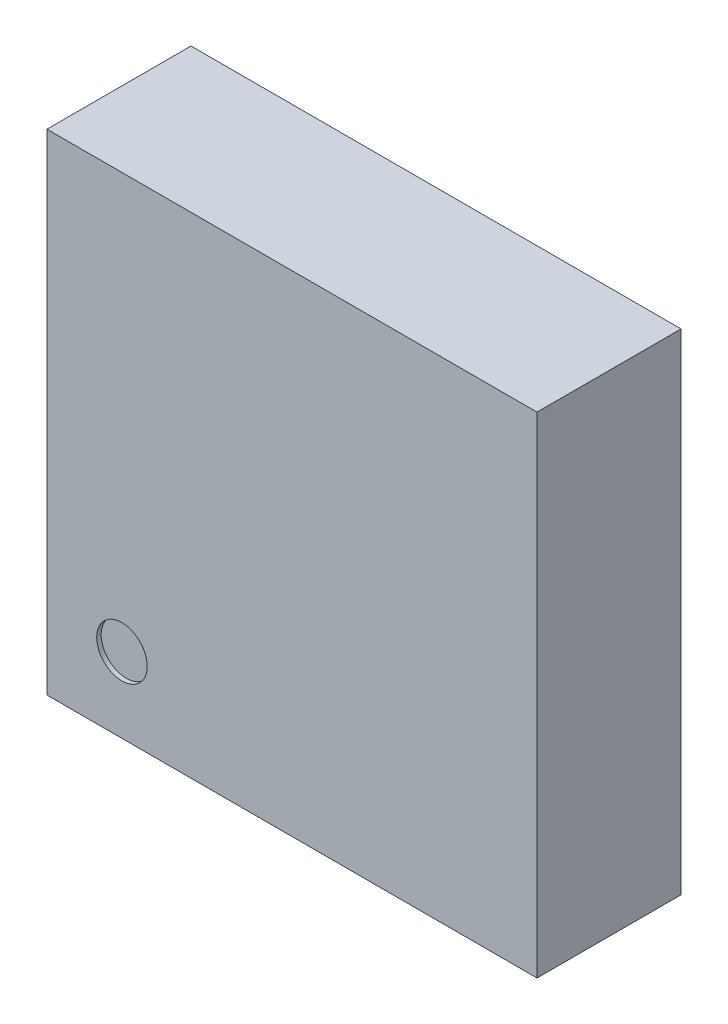
ISO-10303-21;
HEADER;
FILE_DESCRIPTION(('STEP AP214'),'2;1');
FILE_NAME('part.step','',(''),(''),'','','');
FILE_SCHEMA(('AUTOMOTIVE_DESIGN { 1 0 10303 214 1 1 1 1 }'));
ENDSEC;
DATA;
#1=APPLICATION_CONTEXT('core data for automotive mechanical design processes');
#2=APPLICATION_PROTOCOL_DEFINITION('international standard','automotive_design',2000,#1);
#3=PRODUCT_CONTEXT('',#1,'mechanical');
#4=PRODUCT('Part','Part','',(#3));
#5=PRODUCT_RELATED_PRODUCT_CATEGORY('part','',(#4));
#6=PRODUCT_DEFINITION_FORMATION('','',#4);
#7=PRODUCT_DEFINITION_CONTEXT('part definition',#1,'design');
#8=PRODUCT_DEFINITION('design','',#6,#7);
#9=PRODUCT_DEFINITION_SHAPE('','',#8);
#10=(LENGTH_UNIT() NAMED_UNIT(*) SI_UNIT(.MILLI.,.METRE.));
#11=(NAMED_UNIT(*) PLANE_ANGLE_UNIT() SI_UNIT($,.RADIAN.));
#12=(NAMED_UNIT(*) SI_UNIT($,.STERADIAN.) SOLID_ANGLE_UNIT());
#13=UNCERTAINTY_MEASURE_WITH_UNIT(LENGTH_MEASURE(1.E-05),#10,'distance_accuracy_value','');
#14=(GEOMETRIC_REPRESENTATION_CONTEXT(3) GLOBAL_UNCERTAINTY_ASSIGNED_CONTEXT((#13)) GLOBAL_UNIT_ASSIGNED_CONTEXT((#10,
#11,#12)) REPRESENTATION_CONTEXT('',''));
#15=CARTESIAN_POINT('',(0.,0.,0.));
#16=DIRECTION('',(0.,0.,1.));
#17=DIRECTION('',(1.,0.,0.));
#18=AXIS2_PLACEMENT_3D('',#15,#16,#17);
#19=CARTESIAN_POINT('',(48.2138,15.2499,2.67));
#20=DIRECTION('',(0.,0.,1.));
#21=DIRECTION('',(1.,0.,0.));
#22=AXIS2_PLACEMENT_3D('',#19,#20,#21);
#23=CYLINDRICAL_SURFACE('',#22,0.17);
#24=CARTESIAN_POINT('',(48.21380000001,15.24990000001,2.67000000001));
#25=DIRECTION('',(0.,0.,1.));
#26=DIRECTION('',(1.,0.,0.));
#27=AXIS2_PLACEMENT_3D('',#24,#25,#26);
#28=CIRCLE('',#27,0.17000000001);
#29=CARTESIAN_POINT('',(48.38380000002,15.24990000001,2.67000000001));
#30=VERTEX_POINT('',#29);
#31=EDGE_CURVE('E11',#30,#30,#28,.T.);
#32=ORIENTED_EDGE('',*,*,#31,.F.);
#33=EDGE_LOOP('',(#32));
#34=FACE_BOUND('',#33,.T.);
#35=CARTESIAN_POINT('',(48.21380000001,15.24990000001,2.70000000001));
#36=DIRECTION('',(0.,0.,-1.));
#37=DIRECTION('',(-1.,0.,0.));
#38=AXIS2_PLACEMENT_3D('',#35,#36,#37);
#39=CIRCLE('',#38,0.17000000001);
#40=CARTESIAN_POINT('',(48.0438,15.24990000001,2.70000000001));
#41=VERTEX_POINT('',#40);
#42=EDGE_CURVE('E27',#41,#41,#39,.T.);
#43=ORIENTED_EDGE('',*,*,#42,.F.);
#44=EDGE_LOOP('',(#43));
#45=FACE_BOUND('',#44,.T.);
#46=ADVANCED_FACE('F17',(#34,#45),#23,.F.);
#47=CARTESIAN_POINT('',(48.2138,15.2499,2.67));
#48=DIRECTION('',(0.,0.,1.));
#49=DIRECTION('',(1.,0.,0.));
#50=AXIS2_PLACEMENT_3D('',#47,#48,#49);
#51=PLANE('',#50);
#52=ORIENTED_EDGE('',*,*,#31,.T.);
#53=EDGE_LOOP('',(#52));
#54=FACE_BOUND('',#53,.T.);
#55=ADVANCED_FACE('F155',(#54),#51,.T.);
#56=CARTESIAN_POINT('',(51.0088,14.7449,2.7));
#57=DIRECTION('',(0.,0.,-1.));
#58=DIRECTION('',(0.,-1.,0.));
#59=AXIS2_PLACEMENT_3D('',#56,#57,#58);
#60=PLANE('',#59);
#61=DIRECTION('',(0.,-1.,0.));
#62=VECTOR('',#61,1.);
#63=CARTESIAN_POINT('',(51.00880000001,18.04490000001,2.70000000001));
#64=LINE('',#63,#62);
#65=CARTESIAN_POINT('',(51.0088,18.0449,2.7));
#66=VERTEX_POINT('',#65);
#67=CARTESIAN_POINT('',(51.0088,14.7449,2.7));
#68=VERTEX_POINT('',#67);
#69=EDGE_CURVE('E74',#66,#68,#64,.T.);
#70=ORIENTED_EDGE('',*,*,#69,.F.);
#71=DIRECTION('',(1.,0.,0.));
#72=VECTOR('',#71,1.);
#73=CARTESIAN_POINT('',(47.70880000001,18.04490000001,2.70000000001));
#74=LINE('',#73,#72);
#75=CARTESIAN_POINT('',(47.7088,18.0449,2.7));
#76=VERTEX_POINT('',#75);
#77=EDGE_CURVE('E39',#76,#66,#74,.T.);
#78=ORIENTED_EDGE('',*,*,#77,.F.);
#79=DIRECTION('',(0.,1.,0.));
#80=VECTOR('',#79,1.);
#81=CARTESIAN_POINT('',(47.70880000001,14.74490000001,2.70000000001));
#82=LINE('',#81,#80);
#83=CARTESIAN_POINT('',(47.7088,14.7449,2.7));
#84=VERTEX_POINT('',#83);
#85=EDGE_CURVE('E79',#84,#76,#82,.T.);
#86=ORIENTED_EDGE('',*,*,#85,.F.);
#87=DIRECTION('',(-1.,0.,0.));
#88=VECTOR('',#87,1.);
#89=CARTESIAN_POINT('',(51.00880000001,14.74490000001,2.70000000001));
#90=LINE('',#89,#88);
#91=EDGE_CURVE('E83',#68,#84,#90,.T.);
#92=ORIENTED_EDGE('',*,*,#91,.F.);
#93=EDGE_LOOP('',(#70,#78,#86,#92));
#94=FACE_BOUND('',#93,.T.);
#95=ORIENTED_EDGE('',*,*,#42,.T.);
#96=EDGE_LOOP('',(#95));
#97=FACE_BOUND('',#96,.T.);
#98=ADVANCED_FACE('F81',(#94,#97),#60,.F.);
#99=CARTESIAN_POINT('',(47.7088,14.7449,2.7));
#100=DIRECTION('',(0.,1.,0.));
#101=DIRECTION('',(1.,0.,0.));
#102=AXIS2_PLACEMENT_3D('',#99,#100,#101);
#103=PLANE('',#102);
#104=DIRECTION('',(0.,0.,1.));
#105=VECTOR('',#104,1.);
#106=CARTESIAN_POINT('',(51.00880000001,14.74490000001,1.73000000001));
#107=LINE('',#106,#105);
#108=CARTESIAN_POINT('',(51.0088,14.7449,1.73));
#109=VERTEX_POINT('',#108);
#110=EDGE_CURVE('E94',#109,#68,#107,.T.);
#111=ORIENTED_EDGE('',*,*,#110,.T.);
#112=ORIENTED_EDGE('',*,*,#91,.T.);
#113=DIRECTION('',(0.,0.,1.));
#114=VECTOR('',#113,1.);
#115=CARTESIAN_POINT('',(47.70880000001,14.74490000001,1.73000000001));
#116=LINE('',#115,#114);
#117=CARTESIAN_POINT('',(47.7088,14.7449,1.73));
#118=VERTEX_POINT('',#117);
#119=EDGE_CURVE('E89',#118,#84,#116,.T.);
#120=ORIENTED_EDGE('',*,*,#119,.F.);
#121=DIRECTION('',(-1.,0.,0.));
#122=VECTOR('',#121,1.);
#123=CARTESIAN_POINT('',(51.00880000001,14.74490000001,1.73000000001));
#124=LINE('',#123,#122);
#125=EDGE_CURVE('E108',#109,#118,#124,.T.);
#126=ORIENTED_EDGE('',*,*,#125,.F.);
#127=EDGE_LOOP('',(#111,#112,#120,#126));
#128=FACE_BOUND('',#127,.T.);
#129=ADVANCED_FACE('F92',(#128),#103,.F.);
#130=CARTESIAN_POINT('',(51.0088,14.7449,1.73));
#131=DIRECTION('',(0.,0.,-1.));
#132=DIRECTION('',(0.,-1.,0.));
#133=AXIS2_PLACEMENT_3D('',#130,#131,#132);
#134=PLANE('',#133);
#135=DIRECTION('',(0.,1.,0.));
#136=VECTOR('',#135,1.);
#137=CARTESIAN_POINT('',(47.70880000001,14.74490000001,1.73000000001));
#138=LINE('',#137,#136);
#139=CARTESIAN_POINT('',(47.7088,18.0449,1.73));
#140=VERTEX_POINT('',#139);
#141=EDGE_CURVE('E96',#118,#140,#138,.T.);
#142=ORIENTED_EDGE('',*,*,#141,.T.);
#143=DIRECTION('',(1.,0.,0.));
#144=VECTOR('',#143,1.);
#145=CARTESIAN_POINT('',(47.70880000001,18.04490000001,1.73000000001));
#146=LINE('',#145,#144);
#147=CARTESIAN_POINT('',(51.0088,18.0449,1.73));
#148=VERTEX_POINT('',#147);
#149=EDGE_CURVE('E60',#140,#148,#146,.T.);
#150=ORIENTED_EDGE('',*,*,#149,.T.);
#151=DIRECTION('',(0.,-1.,0.));
#152=VECTOR('',#151,1.);
#153=CARTESIAN_POINT('',(51.00880000001,18.04490000001,1.73000000001));
#154=LINE('',#153,#152);
#155=EDGE_CURVE('E54',#148,#109,#154,.T.);
#156=ORIENTED_EDGE('',*,*,#155,.T.);
#157=ORIENTED_EDGE('',*,*,#125,.T.);
#158=EDGE_LOOP('',(#142,#150,#156,#157));
#159=FACE_BOUND('',#158,.T.);
#160=ADVANCED_FACE('F121',(#159),#134,.T.);
#161=CARTESIAN_POINT('',(51.0088,18.0449,2.7));
#162=DIRECTION('',(-1.,0.,0.));
#163=DIRECTION('',(0.,0.,1.));
#164=AXIS2_PLACEMENT_3D('',#161,#162,#163);
#165=PLANE('',#164);
#166=DIRECTION('',(0.,0.,1.));
#167=VECTOR('',#166,1.);
#168=CARTESIAN_POINT('',(51.00880000001,18.04490000001,1.73000000001));
#169=LINE('',#168,#167);
#170=EDGE_CURVE('E20',#148,#66,#169,.T.);
#171=ORIENTED_EDGE('',*,*,#170,.T.);
#172=ORIENTED_EDGE('',*,*,#69,.T.);
#173=ORIENTED_EDGE('',*,*,#110,.F.);
#174=ORIENTED_EDGE('',*,*,#155,.F.);
#175=EDGE_LOOP('',(#171,#172,#173,#174));
#176=FACE_BOUND('',#175,.T.);
#177=ADVANCED_FACE('F141',(#176),#165,.F.);
#178=CARTESIAN_POINT('',(47.7088,18.0449,2.7));
#179=DIRECTION('',(0.,-1.,0.));
#180=DIRECTION('',(0.,0.,-1.));
#181=AXIS2_PLACEMENT_3D('',#178,#179,#180);
#182=PLANE('',#181);
#183=DIRECTION('',(0.,0.,1.));
#184=VECTOR('',#183,1.);
#185=CARTESIAN_POINT('',(47.70880000001,18.04490000001,1.73000000001));
#186=LINE('',#185,#184);
#187=EDGE_CURVE('E104',#140,#76,#186,.T.);
#188=ORIENTED_EDGE('',*,*,#187,.T.);
#189=ORIENTED_EDGE('',*,*,#77,.T.);
#190=ORIENTED_EDGE('',*,*,#170,.F.);
#191=ORIENTED_EDGE('',*,*,#149,.F.);
#192=EDGE_LOOP('',(#188,#189,#190,#191));
#193=FACE_BOUND('',#192,.T.);
#194=ADVANCED_FACE('F122',(#193),#182,.F.);
#195=CARTESIAN_POINT('',(47.7088,18.0449,2.7));
#196=DIRECTION('',(1.,0.,0.));
#197=DIRECTION('',(0.,1.,0.));
#198=AXIS2_PLACEMENT_3D('',#195,#196,#197);
#199=PLANE('',#198);
#200=ORIENTED_EDGE('',*,*,#119,.T.);
#201=ORIENTED_EDGE('',*,*,#85,.T.);
#202=ORIENTED_EDGE('',*,*,#187,.F.);
#203=ORIENTED_EDGE('',*,*,#141,.F.);
#204=EDGE_LOOP('',(#200,#201,#202,#203));
#205=FACE_BOUND('',#204,.T.);
#206=ADVANCED_FACE('F99',(#205),#199,.F.);
#207=CLOSED_SHELL('',(#46,#55,#98,#129,#160,#177,#194,#206));
#208=MANIFOLD_SOLID_BREP('B1',#207);
#209=ADVANCED_BREP_SHAPE_REPRESENTATION('',(#18,#208),#14);
#210=SHAPE_DEFINITION_REPRESENTATION(#9,#209);
ENDSEC;
END-ISO-10303-21;
